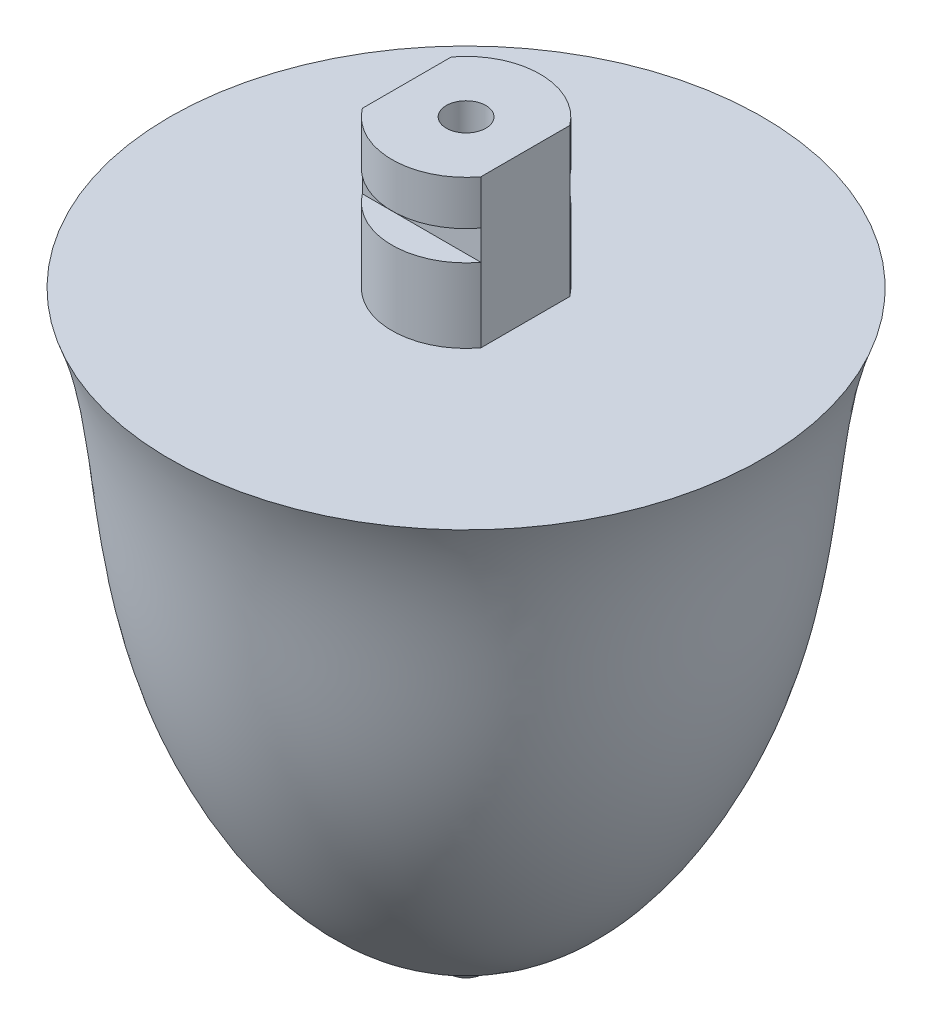
ISO-10303-21;
HEADER;
FILE_DESCRIPTION(('STEP AP214'),'2;1');
FILE_NAME('part.step','',(''),(''),'','','');
FILE_SCHEMA(('AUTOMOTIVE_DESIGN { 1 0 10303 214 1 1 1 1 }'));
ENDSEC;
DATA;
#1=APPLICATION_CONTEXT('core data for automotive mechanical design processes');
#2=APPLICATION_PROTOCOL_DEFINITION('international standard','automotive_design',2000,#1);
#3=PRODUCT_CONTEXT('',#1,'mechanical');
#4=PRODUCT('Part','Part','',(#3));
#5=PRODUCT_RELATED_PRODUCT_CATEGORY('part','',(#4));
#6=PRODUCT_DEFINITION_FORMATION('','',#4);
#7=PRODUCT_DEFINITION_CONTEXT('part definition',#1,'design');
#8=PRODUCT_DEFINITION('design','',#6,#7);
#9=PRODUCT_DEFINITION_SHAPE('','',#8);
#10=(LENGTH_UNIT() NAMED_UNIT(*) SI_UNIT(.MILLI.,.METRE.));
#11=(NAMED_UNIT(*) PLANE_ANGLE_UNIT() SI_UNIT($,.RADIAN.));
#12=(NAMED_UNIT(*) SI_UNIT($,.STERADIAN.) SOLID_ANGLE_UNIT());
#13=UNCERTAINTY_MEASURE_WITH_UNIT(LENGTH_MEASURE(1.E-05),#10,'distance_accuracy_value','');
#14=(GEOMETRIC_REPRESENTATION_CONTEXT(3) GLOBAL_UNCERTAINTY_ASSIGNED_CONTEXT((#13)) GLOBAL_UNIT_ASSIGNED_CONTEXT((#10,
#11,#12)) REPRESENTATION_CONTEXT('',''));
#15=CARTESIAN_POINT('',(0.,0.,0.));
#16=DIRECTION('',(0.,0.,1.));
#17=DIRECTION('',(1.,0.,0.));
#18=AXIS2_PLACEMENT_3D('',#15,#16,#17);
#19=CARTESIAN_POINT('',(0.,30.,0.));
#20=DIRECTION('',(0.,-1.,0.));
#21=DIRECTION('',(0.,0.,-1.));
#22=AXIS2_PLACEMENT_3D('',#19,#20,#21);
#23=CYLINDRICAL_SURFACE('',#22,15.);
#24=DIRECTION('',(0.,-1.,0.));
#25=VECTOR('',#24,1.);
#26=CARTESIAN_POINT('',(12.,30.,-9.));
#27=LINE('',#26,#25);
#28=CARTESIAN_POINT('',(12.,30.,-9.));
#29=VERTEX_POINT('',#28);
#30=CARTESIAN_POINT('',(12.,21.,-9.));
#31=VERTEX_POINT('',#30);
#32=EDGE_CURVE('E132',#29,#31,#27,.T.);
#33=ORIENTED_EDGE('',*,*,#32,.T.);
#34=CARTESIAN_POINT('',(0.,21.,0.));
#35=DIRECTION('',(0.,1.,0.));
#36=DIRECTION('',(0.,0.,1.));
#37=AXIS2_PLACEMENT_3D('',#34,#35,#36);
#38=CIRCLE('',#37,15.);
#39=CARTESIAN_POINT('',(-12.,21.,-9.));
#40=VERTEX_POINT('',#39);
#41=EDGE_CURVE('E126',#40,#31,#38,.F.);
#42=ORIENTED_EDGE('',*,*,#41,.F.);
#43=DIRECTION('',(0.,-1.,0.));
#44=VECTOR('',#43,1.);
#45=CARTESIAN_POINT('',(-12.,30.,-9.));
#46=LINE('',#45,#44);
#47=CARTESIAN_POINT('',(-12.,30.,-9.));
#48=VERTEX_POINT('',#47);
#49=EDGE_CURVE('E148',#48,#40,#46,.T.);
#50=ORIENTED_EDGE('',*,*,#49,.F.);
#51=CARTESIAN_POINT('',(0.,30.,0.));
#52=DIRECTION('',(0.,1.,0.));
#53=DIRECTION('',(0.,0.,1.));
#54=AXIS2_PLACEMENT_3D('',#51,#52,#53);
#55=CIRCLE('',#54,15.);
#56=EDGE_CURVE('E224',#29,#48,#55,.T.);
#57=ORIENTED_EDGE('',*,*,#56,.F.);
#58=EDGE_LOOP('',(#33,#42,#50,#57));
#59=FACE_BOUND('',#58,.T.);
#60=ADVANCED_FACE('F36',(#59),#23,.T.);
#61=CARTESIAN_POINT('',(0.,30.,0.));
#62=DIRECTION('',(0.,-1.,0.));
#63=DIRECTION('',(0.,0.,-1.));
#64=AXIS2_PLACEMENT_3D('',#61,#62,#63);
#65=CYLINDRICAL_SURFACE('',#64,15.);
#66=CARTESIAN_POINT('',(0.,15.,0.));
#67=DIRECTION('',(0.,1.,0.));
#68=DIRECTION('',(0.,0.,1.));
#69=AXIS2_PLACEMENT_3D('',#66,#67,#68);
#70=CIRCLE('',#69,15.);
#71=CARTESIAN_POINT('',(12.,15.,9.));
#72=VERTEX_POINT('',#71);
#73=CARTESIAN_POINT('',(-12.,15.,9.));
#74=VERTEX_POINT('',#73);
#75=EDGE_CURVE('E58',#72,#74,#70,.F.);
#76=ORIENTED_EDGE('',*,*,#75,.T.);
#77=DIRECTION('',(0.,-1.,0.));
#78=VECTOR('',#77,1.);
#79=CARTESIAN_POINT('',(-12.,30.,9.));
#80=LINE('',#79,#78);
#81=CARTESIAN_POINT('',(-12.,0.,9.));
#82=VERTEX_POINT('',#81);
#83=EDGE_CURVE('E144',#74,#82,#80,.T.);
#84=ORIENTED_EDGE('',*,*,#83,.T.);
#85=CARTESIAN_POINT('',(0.,0.,0.));
#86=DIRECTION('',(0.,1.,0.));
#87=DIRECTION('',(0.,0.,1.));
#88=AXIS2_PLACEMENT_3D('',#85,#86,#87);
#89=CIRCLE('',#88,15.);
#90=CARTESIAN_POINT('',(12.,0.,9.));
#91=VERTEX_POINT('',#90);
#92=EDGE_CURVE('E262',#82,#91,#89,.T.);
#93=ORIENTED_EDGE('',*,*,#92,.T.);
#94=DIRECTION('',(0.,-1.,0.));
#95=VECTOR('',#94,1.);
#96=CARTESIAN_POINT('',(12.,30.,9.));
#97=LINE('',#96,#95);
#98=EDGE_CURVE('E135',#72,#91,#97,.T.);
#99=ORIENTED_EDGE('',*,*,#98,.F.);
#100=EDGE_LOOP('',(#76,#84,#93,#99));
#101=FACE_BOUND('',#100,.T.);
#102=ADVANCED_FACE('F177',(#101),#65,.T.);
#103=CARTESIAN_POINT('',(0.,21.,0.));
#104=DIRECTION('',(0.,-1.,0.));
#105=DIRECTION('',(0.,0.,-1.));
#106=AXIS2_PLACEMENT_3D('',#103,#104,#105);
#107=CIRCLE('',#106,15.);
#108=CARTESIAN_POINT('',(-12.,21.,9.));
#109=VERTEX_POINT('',#108);
#110=CARTESIAN_POINT('',(12.,21.,9.));
#111=VERTEX_POINT('',#110);
#112=EDGE_CURVE('E117',#109,#111,#107,.F.);
#113=ORIENTED_EDGE('',*,*,#112,.T.);
#114=CARTESIAN_POINT('',(12.,30.,9.));
#115=VERTEX_POINT('',#114);
#116=EDGE_CURVE('E141',#115,#111,#97,.T.);
#117=ORIENTED_EDGE('',*,*,#116,.F.);
#118=CARTESIAN_POINT('',(0.,30.,0.));
#119=DIRECTION('',(0.,1.,0.));
#120=DIRECTION('',(0.,0.,1.));
#121=AXIS2_PLACEMENT_3D('',#118,#119,#120);
#122=CIRCLE('',#121,15.);
#123=CARTESIAN_POINT('',(-12.,30.,9.));
#124=VERTEX_POINT('',#123);
#125=EDGE_CURVE('E136',#124,#115,#122,.T.);
#126=ORIENTED_EDGE('',*,*,#125,.F.);
#127=EDGE_CURVE('E145',#124,#109,#80,.T.);
#128=ORIENTED_EDGE('',*,*,#127,.T.);
#129=EDGE_LOOP('',(#113,#117,#126,#128));
#130=FACE_BOUND('',#129,.T.);
#131=ADVANCED_FACE('F180',(#130),#65,.T.);
#132=CARTESIAN_POINT('',(0.,0.,0.));
#133=DIRECTION('',(0.,-1.,0.));
#134=DIRECTION('',(1.,0.,0.));
#135=AXIS2_PLACEMENT_3D('',#132,#133,#134);
#136=PLANE('',#135);
#137=CARTESIAN_POINT('',(0.,0.,0.));
#138=DIRECTION('',(0.,1.,0.));
#139=DIRECTION('',(-1.,0.,0.));
#140=AXIS2_PLACEMENT_3D('',#137,#138,#139);
#141=CIRCLE('',#140,60.);
#142=CARTESIAN_POINT('',(-60.,0.,0.));
#143=VERTEX_POINT('',#142);
#144=EDGE_CURVE('E11',#143,#143,#141,.T.);
#145=ORIENTED_EDGE('',*,*,#144,.T.);
#146=EDGE_LOOP('',(#145));
#147=FACE_BOUND('',#146,.T.);
#148=CARTESIAN_POINT('',(0.,0.,0.));
#149=DIRECTION('',(0.,1.,0.));
#150=DIRECTION('',(0.,0.,1.));
#151=AXIS2_PLACEMENT_3D('',#148,#149,#150);
#152=CIRCLE('',#151,15.);
#153=CARTESIAN_POINT('',(12.,0.,-9.));
#154=VERTEX_POINT('',#153);
#155=CARTESIAN_POINT('',(-12.,0.,-9.));
#156=VERTEX_POINT('',#155);
#157=EDGE_CURVE('E254',#154,#156,#152,.T.);
#158=ORIENTED_EDGE('',*,*,#157,.F.);
#159=DIRECTION('',(0.,0.,-1.));
#160=VECTOR('',#159,1.);
#161=CARTESIAN_POINT('',(12.,0.,-9.));
#162=LINE('',#161,#160);
#163=EDGE_CURVE('E131',#91,#154,#162,.T.);
#164=ORIENTED_EDGE('',*,*,#163,.F.);
#165=ORIENTED_EDGE('',*,*,#92,.F.);
#166=DIRECTION('',(0.,0.,1.));
#167=VECTOR('',#166,1.);
#168=CARTESIAN_POINT('',(-12.,0.,-9.));
#169=LINE('',#168,#167);
#170=EDGE_CURVE('E260',#156,#82,#169,.T.);
#171=ORIENTED_EDGE('',*,*,#170,.F.);
#172=EDGE_LOOP('',(#158,#164,#165,#171));
#173=FACE_BOUND('',#172,.T.);
#174=ADVANCED_FACE('F38',(#147,#173),#136,.F.);
#175=CARTESIAN_POINT('',(13.0772506287102,-110.,0.));
#176=CARTESIAN_POINT('',(26.441462871209,-105.381596251,0.));
#177=CARTESIAN_POINT('',(58.4000001216913,-57.5710509546732,0.));
#178=CARTESIAN_POINT('',(51.5986788780342,-21.7946328630877,0.));
#179=CARTESIAN_POINT('',(60.,0.,0.));
#180=B_SPLINE_CURVE_WITH_KNOTS('',3,(#175,#176,#177,#178,#179),.UNSPECIFIED.,.F.,.F.,(4,1,4),
(0.0176675941788211,0.353401105619974,1.),.UNSPECIFIED.);
#181=CARTESIAN_POINT('',(0.,0.,0.));
#182=DIRECTION('',(0.,1.,0.));
#183=AXIS1_PLACEMENT('',#181,#182);
#184=SURFACE_OF_REVOLUTION('',#180,#183);
#185=ORIENTED_EDGE('',*,*,#144,.F.);
#186=EDGE_LOOP('',(#185));
#187=FACE_BOUND('',#186,.T.);
#188=CARTESIAN_POINT('',(0.,-110.,0.));
#189=DIRECTION('',(0.,1.,0.));
#190=DIRECTION('',(-1.,0.,0.));
#191=AXIS2_PLACEMENT_3D('',#188,#189,#190);
#192=CIRCLE('',#191,13.0772506287102);
#193=CARTESIAN_POINT('',(-13.0772506287102,-110.,0.));
#194=VERTEX_POINT('',#193);
#195=EDGE_CURVE('E44',#194,#194,#192,.T.);
#196=ORIENTED_EDGE('',*,*,#195,.T.);
#197=EDGE_LOOP('',(#196));
#198=FACE_BOUND('',#197,.T.);
#199=ADVANCED_FACE('F159',(#187,#198),#184,.T.);
#200=CARTESIAN_POINT('',(0.,-123.544955301797,0.));
#201=DIRECTION('',(0.,1.,0.));
#202=DIRECTION('',(-1.,0.,0.));
#203=AXIS2_PLACEMENT_3D('',#200,#201,#202);
#204=TOROIDAL_SURFACE('',#203,17.7581155544354,14.3309563735486);
#205=ORIENTED_EDGE('',*,*,#195,.F.);
#206=EDGE_LOOP('',(#205));
#207=FACE_BOUND('',#206,.T.);
#208=CARTESIAN_POINT('',(0.,-116.406526078074,0.));
#209=DIRECTION('',(0.,1.,0.));
#210=DIRECTION('',(-1.,0.,0.));
#211=AXIS2_PLACEMENT_3D('',#208,#209,#210);
#212=CIRCLE('',#211,5.33156580004034);
#213=CARTESIAN_POINT('',(-5.33156580004033,-116.406526078074,0.));
#214=VERTEX_POINT('',#213);
#215=EDGE_CURVE('E151',#214,#214,#212,.T.);
#216=ORIENTED_EDGE('',*,*,#215,.T.);
#217=EDGE_LOOP('',(#216));
#218=FACE_BOUND('',#217,.T.);
#219=ADVANCED_FACE('F162',(#207,#218),#204,.F.);
#220=CARTESIAN_POINT('',(0.994560870630372,-112.772483774182,0.));
#221=DIRECTION('',(0.,0.,-1.));
#222=DIRECTION('',(-1.,0.,0.));
#223=AXIS2_PLACEMENT_3D('',#220,#221,#222);
#224=CIRCLE('',#223,7.29562486150745);
#225=TRIMMED_CURVE('',#224,(PARAMETER_VALUE(-1.43404760193956)),
(PARAMETER_VALUE(1.43404760193956)),.T.,.PARAMETER.);
#226=CARTESIAN_POINT('',(0.,-112.772483774182,0.));
#227=DIRECTION('',(0.,1.,0.));
#228=AXIS1_PLACEMENT('',#226,#227);
#229=SURFACE_OF_REVOLUTION('',#225,#228);
#230=ORIENTED_EDGE('',*,*,#215,.F.);
#231=EDGE_LOOP('',(#230));
#232=FACE_BOUND('',#231,.T.);
#233=CARTESIAN_POINT('',(0.,-120.,0.));
#234=VERTEX_POINT('',#233);
#235=VERTEX_LOOP('',#234);
#236=FACE_BOUND('',#235,.T.);
#237=ADVANCED_FACE('F166',(#232,#236),#229,.T.);
#238=CARTESIAN_POINT('',(-12.,15.,-9.));
#239=VERTEX_POINT('',#238);
#240=EDGE_CURVE('E124',#239,#156,#46,.T.);
#241=ORIENTED_EDGE('',*,*,#240,.F.);
#242=CARTESIAN_POINT('',(0.,15.,0.));
#243=DIRECTION('',(0.,-1.,0.));
#244=DIRECTION('',(0.,0.,-1.));
#245=AXIS2_PLACEMENT_3D('',#242,#243,#244);
#246=CIRCLE('',#245,15.);
#247=CARTESIAN_POINT('',(12.,15.,-9.));
#248=VERTEX_POINT('',#247);
#249=EDGE_CURVE('E116',#248,#239,#246,.F.);
#250=ORIENTED_EDGE('',*,*,#249,.F.);
#251=EDGE_CURVE('E122',#248,#154,#27,.T.);
#252=ORIENTED_EDGE('',*,*,#251,.T.);
#253=ORIENTED_EDGE('',*,*,#157,.T.);
#254=EDGE_LOOP('',(#241,#250,#252,#253));
#255=FACE_BOUND('',#254,.T.);
#256=ADVANCED_FACE('F120',(#255),#23,.T.);
#257=CARTESIAN_POINT('',(-12.,30.,-9.));
#258=DIRECTION('',(1.,0.,0.));
#259=DIRECTION('',(0.,0.,-1.));
#260=AXIS2_PLACEMENT_3D('',#257,#258,#259);
#261=PLANE('',#260);
#262=ORIENTED_EDGE('',*,*,#170,.T.);
#263=ORIENTED_EDGE('',*,*,#83,.F.);
#264=DIRECTION('',(0.,-1.,0.));
#265=VECTOR('',#264,1.);
#266=CARTESIAN_POINT('',(-12.,21.,9.));
#267=LINE('',#266,#265);
#268=EDGE_CURVE('E238',#109,#74,#267,.T.);
#269=ORIENTED_EDGE('',*,*,#268,.F.);
#270=ORIENTED_EDGE('',*,*,#127,.F.);
#271=DIRECTION('',(0.,0.,1.));
#272=VECTOR('',#271,1.);
#273=CARTESIAN_POINT('',(-12.,30.,-9.));
#274=LINE('',#273,#272);
#275=EDGE_CURVE('E230',#48,#124,#274,.T.);
#276=ORIENTED_EDGE('',*,*,#275,.F.);
#277=ORIENTED_EDGE('',*,*,#49,.T.);
#278=DIRECTION('',(0.,-1.,0.));
#279=VECTOR('',#278,1.);
#280=CARTESIAN_POINT('',(-12.,21.,-9.));
#281=LINE('',#280,#279);
#282=EDGE_CURVE('E269',#40,#239,#281,.T.);
#283=ORIENTED_EDGE('',*,*,#282,.T.);
#284=ORIENTED_EDGE('',*,*,#240,.T.);
#285=EDGE_LOOP('',(#262,#263,#269,#270,#276,#277,#283,#284));
#286=FACE_BOUND('',#285,.T.);
#287=ADVANCED_FACE('F173',(#286),#261,.F.);
#288=CARTESIAN_POINT('',(12.,30.,-9.));
#289=DIRECTION('',(-1.,0.,0.));
#290=DIRECTION('',(0.,0.,1.));
#291=AXIS2_PLACEMENT_3D('',#288,#289,#290);
#292=PLANE('',#291);
#293=ORIENTED_EDGE('',*,*,#163,.T.);
#294=ORIENTED_EDGE('',*,*,#251,.F.);
#295=DIRECTION('',(0.,1.,0.));
#296=VECTOR('',#295,1.);
#297=CARTESIAN_POINT('',(12.,21.,-9.));
#298=LINE('',#297,#296);
#299=EDGE_CURVE('E103',#248,#31,#298,.T.);
#300=ORIENTED_EDGE('',*,*,#299,.T.);
#301=ORIENTED_EDGE('',*,*,#32,.F.);
#302=DIRECTION('',(0.,0.,-1.));
#303=VECTOR('',#302,1.);
#304=CARTESIAN_POINT('',(12.,30.,-9.));
#305=LINE('',#304,#303);
#306=EDGE_CURVE('E133',#115,#29,#305,.T.);
#307=ORIENTED_EDGE('',*,*,#306,.F.);
#308=ORIENTED_EDGE('',*,*,#116,.T.);
#309=DIRECTION('',(0.,1.,0.));
#310=VECTOR('',#309,1.);
#311=CARTESIAN_POINT('',(12.,21.,9.));
#312=LINE('',#311,#310);
#313=EDGE_CURVE('E245',#72,#111,#312,.T.);
#314=ORIENTED_EDGE('',*,*,#313,.F.);
#315=ORIENTED_EDGE('',*,*,#98,.T.);
#316=EDGE_LOOP('',(#293,#294,#300,#301,#307,#308,#314,#315));
#317=FACE_BOUND('',#316,.T.);
#318=ADVANCED_FACE('F129',(#317),#292,.F.);
#319=CARTESIAN_POINT('',(0.,30.,0.));
#320=DIRECTION('',(0.,1.,0.));
#321=DIRECTION('',(0.,0.,1.));
#322=AXIS2_PLACEMENT_3D('',#319,#320,#321);
#323=PLANE('',#322);
#324=CARTESIAN_POINT('',(0.,30.,0.));
#325=DIRECTION('',(0.,1.,0.));
#326=DIRECTION('',(0.,0.,1.));
#327=AXIS2_PLACEMENT_3D('',#324,#325,#326);
#328=CIRCLE('',#327,4.);
#329=CARTESIAN_POINT('',(0.,30.,4.));
#330=VERTEX_POINT('',#329);
#331=EDGE_CURVE('E250',#330,#330,#328,.T.);
#332=ORIENTED_EDGE('',*,*,#331,.F.);
#333=EDGE_LOOP('',(#332));
#334=FACE_BOUND('',#333,.T.);
#335=ORIENTED_EDGE('',*,*,#56,.T.);
#336=ORIENTED_EDGE('',*,*,#275,.T.);
#337=ORIENTED_EDGE('',*,*,#125,.T.);
#338=ORIENTED_EDGE('',*,*,#306,.T.);
#339=EDGE_LOOP('',(#335,#336,#337,#338));
#340=FACE_BOUND('',#339,.T.);
#341=ADVANCED_FACE('F184',(#334,#340),#323,.T.);
#342=CARTESIAN_POINT('',(0.,0.,0.));
#343=DIRECTION('',(0.,1.,0.));
#344=DIRECTION('',(0.,0.,1.));
#345=AXIS2_PLACEMENT_3D('',#342,#343,#344);
#346=CYLINDRICAL_SURFACE('',#345,4.);
#347=CARTESIAN_POINT('',(0.,0.,0.));
#348=DIRECTION('',(0.,1.,0.));
#349=DIRECTION('',(0.,0.,1.));
#350=AXIS2_PLACEMENT_3D('',#347,#348,#349);
#351=CIRCLE('',#350,4.);
#352=CARTESIAN_POINT('',(0.,0.,4.));
#353=VERTEX_POINT('',#352);
#354=EDGE_CURVE('E251',#353,#353,#351,.T.);
#355=ORIENTED_EDGE('',*,*,#354,.F.);
#356=EDGE_LOOP('',(#355));
#357=FACE_BOUND('',#356,.T.);
#358=ORIENTED_EDGE('',*,*,#331,.T.);
#359=EDGE_LOOP('',(#358));
#360=FACE_BOUND('',#359,.T.);
#361=ADVANCED_FACE('F187',(#357,#360),#346,.F.);
#362=CARTESIAN_POINT('',(0.,0.,0.));
#363=DIRECTION('',(0.,1.,0.));
#364=DIRECTION('',(0.,0.,1.));
#365=AXIS2_PLACEMENT_3D('',#362,#363,#364);
#366=PLANE('',#365);
#367=ORIENTED_EDGE('',*,*,#354,.T.);
#368=EDGE_LOOP('',(#367));
#369=FACE_BOUND('',#368,.T.);
#370=ADVANCED_FACE('F191',(#369),#366,.T.);
#371=CARTESIAN_POINT('',(-12.,15.,60.001));
#372=DIRECTION('',(0.,1.,0.));
#373=DIRECTION('',(0.,0.,1.));
#374=AXIS2_PLACEMENT_3D('',#371,#372,#373);
#375=PLANE('',#374);
#376=DIRECTION('',(1.,0.,0.));
#377=VECTOR('',#376,1.);
#378=CARTESIAN_POINT('',(-12.,15.,9.));
#379=LINE('',#378,#377);
#380=EDGE_CURVE('E243',#74,#72,#379,.T.);
#381=ORIENTED_EDGE('',*,*,#380,.F.);
#382=ORIENTED_EDGE('',*,*,#75,.F.);
#383=EDGE_LOOP('',(#381,#382));
#384=FACE_BOUND('',#383,.T.);
#385=ADVANCED_FACE('F195',(#384),#375,.T.);
#386=CARTESIAN_POINT('',(-12.,21.,60.001));
#387=DIRECTION('',(0.,-1.,0.));
#388=DIRECTION('',(0.,0.,-1.));
#389=AXIS2_PLACEMENT_3D('',#386,#387,#388);
#390=PLANE('',#389);
#391=DIRECTION('',(-1.,0.,0.));
#392=VECTOR('',#391,1.);
#393=CARTESIAN_POINT('',(-12.,21.,9.));
#394=LINE('',#393,#392);
#395=EDGE_CURVE('E248',#111,#109,#394,.T.);
#396=ORIENTED_EDGE('',*,*,#395,.F.);
#397=ORIENTED_EDGE('',*,*,#112,.F.);
#398=EDGE_LOOP('',(#396,#397));
#399=FACE_BOUND('',#398,.T.);
#400=ADVANCED_FACE('F199',(#399),#390,.T.);
#401=CARTESIAN_POINT('',(0.,0.,9.));
#402=DIRECTION('',(0.,0.,1.));
#403=DIRECTION('',(1.,0.,0.));
#404=AXIS2_PLACEMENT_3D('',#401,#402,#403);
#405=PLANE('',#404);
#406=ORIENTED_EDGE('',*,*,#268,.T.);
#407=ORIENTED_EDGE('',*,*,#380,.T.);
#408=ORIENTED_EDGE('',*,*,#313,.T.);
#409=ORIENTED_EDGE('',*,*,#395,.T.);
#410=EDGE_LOOP('',(#406,#407,#408,#409));
#411=FACE_BOUND('',#410,.T.);
#412=ADVANCED_FACE('F202',(#411),#405,.T.);
#413=CARTESIAN_POINT('',(-12.,21.,-60.001));
#414=DIRECTION('',(0.,1.,0.));
#415=DIRECTION('',(0.,0.,1.));
#416=AXIS2_PLACEMENT_3D('',#413,#414,#415);
#417=PLANE('',#416);
#418=ORIENTED_EDGE('',*,*,#41,.T.);
#419=DIRECTION('',(-1.,0.,0.));
#420=VECTOR('',#419,1.);
#421=CARTESIAN_POINT('',(-12.,21.,-9.));
#422=LINE('',#421,#420);
#423=EDGE_CURVE('E51',#31,#40,#422,.T.);
#424=ORIENTED_EDGE('',*,*,#423,.T.);
#425=EDGE_LOOP('',(#418,#424));
#426=FACE_BOUND('',#425,.T.);
#427=ADVANCED_FACE('F206',(#426),#417,.F.);
#428=CARTESIAN_POINT('',(-12.,15.,-60.001));
#429=DIRECTION('',(0.,-1.,0.));
#430=DIRECTION('',(0.,0.,-1.));
#431=AXIS2_PLACEMENT_3D('',#428,#429,#430);
#432=PLANE('',#431);
#433=ORIENTED_EDGE('',*,*,#249,.T.);
#434=DIRECTION('',(1.,0.,0.));
#435=VECTOR('',#434,1.);
#436=CARTESIAN_POINT('',(-12.,15.,-9.));
#437=LINE('',#436,#435);
#438=EDGE_CURVE('E106',#239,#248,#437,.T.);
#439=ORIENTED_EDGE('',*,*,#438,.T.);
#440=EDGE_LOOP('',(#433,#439));
#441=FACE_BOUND('',#440,.T.);
#442=ADVANCED_FACE('F115',(#441),#432,.F.);
#443=CARTESIAN_POINT('',(0.,0.,-9.));
#444=DIRECTION('',(0.,0.,-1.));
#445=DIRECTION('',(1.,0.,0.));
#446=AXIS2_PLACEMENT_3D('',#443,#444,#445);
#447=PLANE('',#446);
#448=ORIENTED_EDGE('',*,*,#282,.F.);
#449=ORIENTED_EDGE('',*,*,#423,.F.);
#450=ORIENTED_EDGE('',*,*,#299,.F.);
#451=ORIENTED_EDGE('',*,*,#438,.F.);
#452=EDGE_LOOP('',(#448,#449,#450,#451));
#453=FACE_BOUND('',#452,.T.);
#454=ADVANCED_FACE('F105',(#453),#447,.T.);
#455=CLOSED_SHELL('',(#60,#102,#131,#174,#199,#219,#237,#256,#287,#318,#341,#361,#370,#385,#400,
#412,#427,#442,#454));
#456=MANIFOLD_SOLID_BREP('B2',#455);
#457=ADVANCED_BREP_SHAPE_REPRESENTATION('',(#18,#456),#14);
#458=SHAPE_DEFINITION_REPRESENTATION(#9,#457);
ENDSEC;
END-ISO-10303-21;
